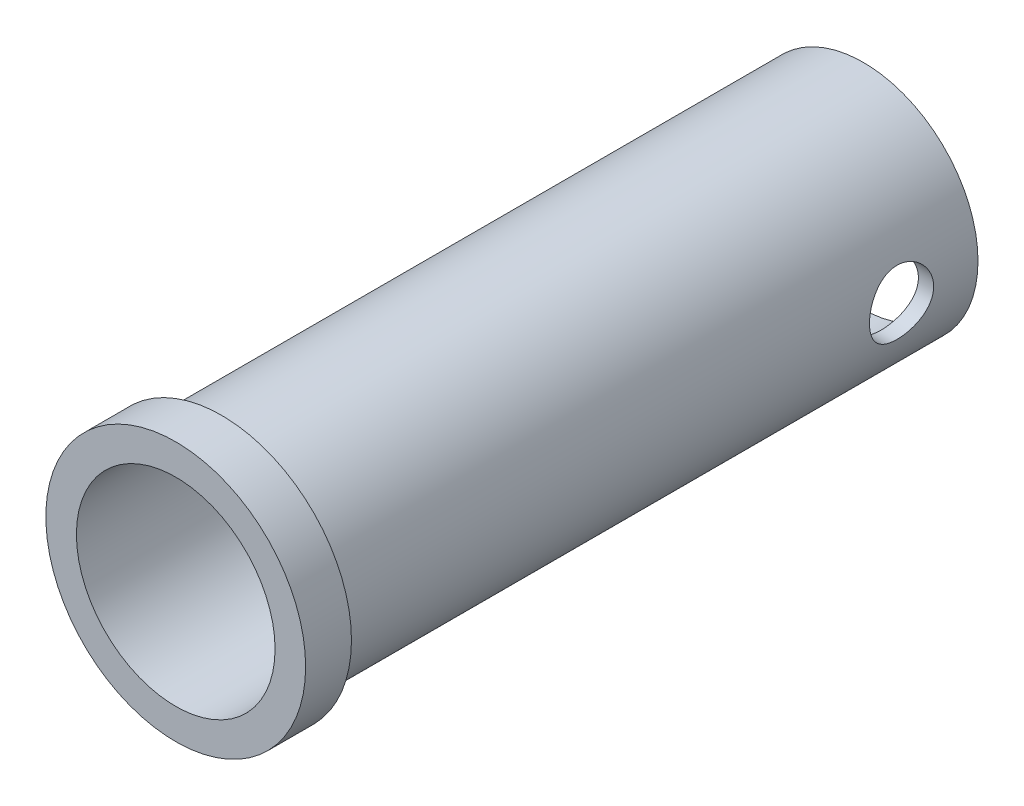
ISO-10303-21;
HEADER;
FILE_DESCRIPTION(('STEP AP214'),'2;1');
FILE_NAME('part.step','',(''),(''),'','','');
FILE_SCHEMA(('AUTOMOTIVE_DESIGN { 1 0 10303 214 1 1 1 1 }'));
ENDSEC;
DATA;
#1=APPLICATION_CONTEXT('core data for automotive mechanical design processes');
#2=APPLICATION_PROTOCOL_DEFINITION('international standard','automotive_design',2000,#1);
#3=PRODUCT_CONTEXT('',#1,'mechanical');
#4=PRODUCT('Part','Part','',(#3));
#5=PRODUCT_RELATED_PRODUCT_CATEGORY('part','',(#4));
#6=PRODUCT_DEFINITION_FORMATION('','',#4);
#7=PRODUCT_DEFINITION_CONTEXT('part definition',#1,'design');
#8=PRODUCT_DEFINITION('design','',#6,#7);
#9=PRODUCT_DEFINITION_SHAPE('','',#8);
#10=(LENGTH_UNIT() NAMED_UNIT(*) SI_UNIT(.MILLI.,.METRE.));
#11=(NAMED_UNIT(*) PLANE_ANGLE_UNIT() SI_UNIT($,.RADIAN.));
#12=(NAMED_UNIT(*) SI_UNIT($,.STERADIAN.) SOLID_ANGLE_UNIT());
#13=UNCERTAINTY_MEASURE_WITH_UNIT(LENGTH_MEASURE(1.E-05),#10,'distance_accuracy_value','');
#14=(GEOMETRIC_REPRESENTATION_CONTEXT(3) GLOBAL_UNCERTAINTY_ASSIGNED_CONTEXT((#13)) GLOBAL_UNIT_ASSIGNED_CONTEXT((#10,
#11,#12)) REPRESENTATION_CONTEXT('',''));
#15=CARTESIAN_POINT('',(0.,0.,0.));
#16=DIRECTION('',(0.,0.,1.));
#17=DIRECTION('',(1.,0.,0.));
#18=AXIS2_PLACEMENT_3D('',#15,#16,#17);
#19=CARTESIAN_POINT('',(0.,0.,0.));
#20=DIRECTION('',(0.,0.,1.));
#21=DIRECTION('',(1.,0.,0.));
#22=AXIS2_PLACEMENT_3D('',#19,#20,#21);
#23=PLANE('',#22);
#24=CARTESIAN_POINT('',(0.,0.,0.));
#25=DIRECTION('',(0.,0.,1.));
#26=DIRECTION('',(1.,0.,0.));
#27=AXIS2_PLACEMENT_3D('',#24,#25,#26);
#28=CIRCLE('',#27,8.5);
#29=CARTESIAN_POINT('',(8.5,0.,0.));
#30=VERTEX_POINT('',#29);
#31=EDGE_CURVE('E53',#30,#30,#28,.T.);
#32=ORIENTED_EDGE('',*,*,#31,.F.);
#33=EDGE_LOOP('',(#32));
#34=FACE_BOUND('',#33,.T.);
#35=CARTESIAN_POINT('',(0.,0.,0.));
#36=DIRECTION('',(0.,0.,1.));
#37=DIRECTION('',(1.,0.,0.));
#38=AXIS2_PLACEMENT_3D('',#35,#36,#37);
#39=CIRCLE('',#38,7.5);
#40=CARTESIAN_POINT('',(7.5,0.,0.));
#41=VERTEX_POINT('',#40);
#42=EDGE_CURVE('E10',#41,#41,#39,.F.);
#43=ORIENTED_EDGE('',*,*,#42,.F.);
#44=EDGE_LOOP('',(#43));
#45=FACE_BOUND('',#44,.T.);
#46=ADVANCED_FACE('F35',(#34,#45),#23,.F.);
#47=CARTESIAN_POINT('',(0.,0.,3.));
#48=DIRECTION('',(0.,0.,1.));
#49=DIRECTION('',(1.,0.,0.));
#50=AXIS2_PLACEMENT_3D('',#47,#48,#49);
#51=PLANE('',#50);
#52=CARTESIAN_POINT('',(0.,0.,3.));
#53=DIRECTION('',(0.,0.,1.));
#54=DIRECTION('',(1.,0.,0.));
#55=AXIS2_PLACEMENT_3D('',#52,#53,#54);
#56=CIRCLE('',#55,8.5);
#57=CARTESIAN_POINT('',(8.5,0.,3.));
#58=VERTEX_POINT('',#57);
#59=EDGE_CURVE('E48',#58,#58,#56,.T.);
#60=ORIENTED_EDGE('',*,*,#59,.T.);
#61=EDGE_LOOP('',(#60));
#62=FACE_BOUND('',#61,.T.);
#63=CARTESIAN_POINT('',(0.,0.,3.));
#64=DIRECTION('',(0.,0.,1.));
#65=DIRECTION('',(1.,0.,0.));
#66=AXIS2_PLACEMENT_3D('',#63,#64,#65);
#67=CIRCLE('',#66,6.5);
#68=CARTESIAN_POINT('',(6.5,0.,3.));
#69=VERTEX_POINT('',#68);
#70=EDGE_CURVE('E103',#69,#69,#67,.T.);
#71=ORIENTED_EDGE('',*,*,#70,.F.);
#72=EDGE_LOOP('',(#71));
#73=FACE_BOUND('',#72,.T.);
#74=ADVANCED_FACE('F91',(#62,#73),#51,.T.);
#75=CARTESIAN_POINT('',(0.,0.,3.));
#76=DIRECTION('',(0.,0.,-1.));
#77=DIRECTION('',(-1.,0.,0.));
#78=AXIS2_PLACEMENT_3D('',#75,#76,#77);
#79=CYLINDRICAL_SURFACE('',#78,8.5);
#80=ORIENTED_EDGE('',*,*,#59,.F.);
#81=EDGE_LOOP('',(#80));
#82=FACE_BOUND('',#81,.T.);
#83=ORIENTED_EDGE('',*,*,#31,.T.);
#84=EDGE_LOOP('',(#83));
#85=FACE_BOUND('',#84,.T.);
#86=ADVANCED_FACE('F37',(#82,#85),#79,.T.);
#87=CARTESIAN_POINT('',(0.,0.,3.));
#88=DIRECTION('',(0.,0.,-1.));
#89=DIRECTION('',(-1.,0.,0.));
#90=AXIS2_PLACEMENT_3D('',#87,#88,#89);
#91=CYLINDRICAL_SURFACE('',#90,6.5);
#92=CARTESIAN_POINT('',(-6.5,0.,-34.9));
#93=CARTESIAN_POINT('',(-6.49999984762594,-0.114780152678519,-34.900000133261));
#94=CARTESIAN_POINT('',(-6.49693136614676,-0.229562646212125,-34.909441164251));
#95=CARTESIAN_POINT('',(-6.48499201245018,-0.455758735968135,-34.9468485895127));
#96=CARTESIAN_POINT('',(-6.47612018587026,-0.567171774928907,-34.9748180307987));
#97=CARTESIAN_POINT('',(-6.45354073761235,-0.783334943692375,-35.0482319288698));
#98=CARTESIAN_POINT('',(-6.43984090576822,-0.888095487627851,-35.0936482462409));
#99=CARTESIAN_POINT('',(-6.40901183916854,-1.08851351392821,-35.2005432242407));
#100=CARTESIAN_POINT('',(-6.39188199424108,-1.18416937216912,-35.2620247433346));
#101=CARTESIAN_POINT('',(-6.35537555243329,-1.36679767568749,-35.4014233998814));
#102=CARTESIAN_POINT('',(-6.33594753880125,-1.45343019593023,-35.4797723483207));
#103=CARTESIAN_POINT('',(-6.29732467015338,-1.61258241008024,-35.6497631071621));
#104=CARTESIAN_POINT('',(-6.27812986315358,-1.68509924230959,-35.7414076064167));
#105=CARTESIAN_POINT('',(-6.24158803844324,-1.81585313888027,-35.9383894207329));
#106=CARTESIAN_POINT('',(-6.22430408492323,-1.87365695616512,-36.0440271375787));
#107=CARTESIAN_POINT('',(-6.19431848653863,-1.97053521369596,-36.2641730612946));
#108=CARTESIAN_POINT('',(-6.18161553983706,-2.00961497600927,-36.3786787368016));
#109=CARTESIAN_POINT('',(-6.16276983931889,-2.06667622660957,-36.6094591201013));
#110=CARTESIAN_POINT('',(-6.15643057256345,-2.08529153012779,-36.7255606061229));
#111=CARTESIAN_POINT('',(-6.15044761140109,-2.10287625070446,-36.9593986910689));
#112=CARTESIAN_POINT('',(-6.15080199454799,-2.101851308528,-37.0771348108124));
#113=CARTESIAN_POINT('',(-6.15799345504348,-2.08067854494973,-37.3055768377815));
#114=CARTESIAN_POINT('',(-6.16455379741828,-2.06134700904492,-37.4163686019231));
#115=CARTESIAN_POINT('',(-6.1829667959278,-2.00543737492301,-37.6330430309594));
#116=CARTESIAN_POINT('',(-6.1948200499337,-1.96885732834052,-37.7389251397825));
#117=CARTESIAN_POINT('',(-6.22268788340782,-1.87893383724713,-37.94467403774));
#118=CARTESIAN_POINT('',(-6.23876362994827,-1.82534134925148,-38.0444233394089));
#119=CARTESIAN_POINT('',(-6.2732382947439,-1.70308717246323,-38.2337759870639));
#120=CARTESIAN_POINT('',(-6.29163785022376,-1.63442134649959,-38.3233765372721));
#121=CARTESIAN_POINT('',(-6.32978643852367,-1.48000669369172,-38.4944892936782));
#122=CARTESIAN_POINT('',(-6.34955748594388,-1.39358721886844,-38.5753925649043));
#123=CARTESIAN_POINT('',(-6.38743186866717,-1.20816261133915,-38.7217118952384));
#124=CARTESIAN_POINT('',(-6.40553506275021,-1.10915641457954,-38.7871266436411));
#125=CARTESIAN_POINT('',(-6.43824721057395,-0.900136372310451,-38.9010630861593));
#126=CARTESIAN_POINT('',(-6.45282391669772,-0.790033092396685,-38.9494305995234));
#127=CARTESIAN_POINT('',(-6.47660732137455,-0.562670821437449,-39.0267726307963));
#128=CARTESIAN_POINT('',(-6.48581576747844,-0.4454141728024,-39.0557534601823));
#129=CARTESIAN_POINT('',(-6.49753974554395,-0.2122355686941,-39.0924414490988));
#130=CARTESIAN_POINT('',(-6.50031423039758,-0.0964560310383878,-39.1009721849127));
#131=CARTESIAN_POINT('',(-6.49962893282386,0.134897611158433,-39.0988518883504));
#132=CARTESIAN_POINT('',(-6.49617013124436,0.250471745156622,-39.0882038738745));
#133=CARTESIAN_POINT('',(-6.48357748396053,0.474897398486163,-39.0486849183147));
#134=CARTESIAN_POINT('',(-6.47459876244501,0.583846122334335,-39.0203117592815));
#135=CARTESIAN_POINT('',(-6.4520280403984,0.795399868811155,-38.9467627922165));
#136=CARTESIAN_POINT('',(-6.43843545964271,0.898004091655653,-38.9015848708016));
#137=CARTESIAN_POINT('',(-6.40759659592119,1.09685611026068,-38.7944320236055));
#138=CARTESIAN_POINT('',(-6.39026632979125,1.19287645758088,-38.7320598528518));
#139=CARTESIAN_POINT('',(-6.35392571159687,1.37335993471931,-38.5927605608013));
#140=CARTESIAN_POINT('',(-6.33491487544933,1.45781971658138,-38.5158292384573));
#141=CARTESIAN_POINT('',(-6.29633442103443,1.61651818338125,-38.3457209755327));
#142=CARTESIAN_POINT('',(-6.27677542522803,1.69016938349651,-38.2519922563222));
#143=CARTESIAN_POINT('',(-6.24014795835414,1.82076055180556,-38.053082794392));
#144=CARTESIAN_POINT('',(-6.22307947542276,1.87770059960644,-37.9479021062294));
#145=CARTESIAN_POINT('',(-6.19354517835395,1.97293988416011,-37.7291691602628));
#146=CARTESIAN_POINT('',(-6.18106547836716,2.0112954720899,-37.6156434271913));
#147=CARTESIAN_POINT('',(-6.16226449334382,2.06819042623143,-37.3832533722931));
#148=CARTESIAN_POINT('',(-6.15594065306915,2.08673801486373,-37.2643912869866));
#149=CARTESIAN_POINT('',(-6.15044597744329,2.10287398644436,-37.0308786474295));
#150=CARTESIAN_POINT('',(-6.1509443099754,2.1014317073017,-36.9163020737839));
#151=CARTESIAN_POINT('',(-6.15822697913326,2.07999175555092,-36.6891122898019));
#152=CARTESIAN_POINT('',(-6.1650109834417,2.05999506389632,-36.5764989759905));
#153=CARTESIAN_POINT('',(-6.18386170119516,2.0026819067383,-36.3582971845668));
#154=CARTESIAN_POINT('',(-6.19583805979404,1.96566104718839,-36.2526226560169));
#155=CARTESIAN_POINT('',(-6.22369569223963,1.87558632651301,-36.0489019638837));
#156=CARTESIAN_POINT('',(-6.23957779800492,1.82252904910129,-35.9508574313432));
#157=CARTESIAN_POINT('',(-6.27427773405697,1.69932067816034,-35.7607816701388));
#158=CARTESIAN_POINT('',(-6.29318990404038,1.62855266631232,-35.6691676284927));
#159=CARTESIAN_POINT('',(-6.33140503172638,1.47299576999185,-35.4988017748997));
#160=CARTESIAN_POINT('',(-6.35070809559453,1.38820303038323,-35.4200535113792));
#161=CARTESIAN_POINT('',(-6.38835851966061,1.20335860583316,-35.2748254649872));
#162=CARTESIAN_POINT('',(-6.40664701425018,1.10286967112843,-35.2088851452565));
#163=CARTESIAN_POINT('',(-6.43943829822981,0.89164585017348,-35.0949130417628));
#164=CARTESIAN_POINT('',(-6.45394231934155,0.780914313486268,-35.0468754290718));
#165=CARTESIAN_POINT('',(-6.4767469097158,0.559731443724436,-34.972831945927));
#166=CARTESIAN_POINT('',(-6.48538779223929,0.449724427071783,-34.9456029358238));
#167=CARTESIAN_POINT('',(-6.49701374152978,0.226478517537958,-34.9091890379217));
#168=CARTESIAN_POINT('',(-6.50000015032999,0.113240398005008,-34.8999998685267));
#169=CARTESIAN_POINT('',(-6.5,0.,-34.9));
#170=B_SPLINE_CURVE_WITH_KNOTS('',3,(#92,#93,#94,#95,#96,#97,#98,#99,#100,#101,#102,#103,#104,
#105,#106,#107,#108,#109,#110,#111,#112,#113,#114,#115,#116,#117,#118,#119,#120,#121,#122,#123,
#124,#125,#126,#127,#128,#129,#130,#131,#132,#133,#134,#135,#136,#137,#138,#139,#140,#141,#142,
#143,#144,#145,#146,#147,#148,#149,#150,#151,#152,#153,#154,#155,#156,#157,#158,#159,#160,#161,
#162,#163,#164,#165,#166,#167,#168,#169),.UNSPECIFIED.,.T.,.F.,(4,2,2,2,2,2,2,2,2,2,2,2,2,2,2,2,
2,2,2,2,2,2,2,2,2,2,2,2,2,2,2,2,2,2,2,2,2,2,4),(0.,0.343923981095443,0.687904534857072,
1.03133260886579,1.37482183034691,1.72845644393134,2.08216267547617,2.4453183332506,
2.80837070746088,3.15983101194151,3.51119037698753,3.84758565907628,4.18401894896813,
4.52562389865708,4.86732272596723,5.22571361317306,5.5841348181231,5.94571918962465,
6.30718578731835,6.6538308659277,7.00042140245965,7.33769086053153,7.67500274828452,
8.02087649799563,8.36685020225927,8.72753837967961,9.088224838858,9.44781068404832,
9.80724720488734,10.1493177330619,10.4913701773347,10.8276953457348,11.1640922130562,
11.5144204767654,11.8648451997129,12.2278019086183,12.5906403392817,12.9300312044731,
13.2693415085097),.UNSPECIFIED.);
#171=CARTESIAN_POINT('',(-6.5,0.,-34.9));
#172=VERTEX_POINT('',#171);
#173=EDGE_CURVE('E81',#172,#172,#170,.T.);
#174=ORIENTED_EDGE('',*,*,#173,.F.);
#175=EDGE_LOOP('',(#174));
#176=FACE_BOUND('',#175,.T.);
#177=CARTESIAN_POINT('',(6.5,0.,-39.1));
#178=CARTESIAN_POINT('',(6.49999984762594,-0.114780152678519,-39.099999866739));
#179=CARTESIAN_POINT('',(6.49693136614676,-0.229562646212125,-39.090558835749));
#180=CARTESIAN_POINT('',(6.48499201245018,-0.455758735968135,-39.0531514104873));
#181=CARTESIAN_POINT('',(6.47612018587026,-0.567171774928906,-39.0251819692013));
#182=CARTESIAN_POINT('',(6.45354073761235,-0.783334943692377,-38.9517680711302));
#183=CARTESIAN_POINT('',(6.43984090576822,-0.888095487627855,-38.9063517537591));
#184=CARTESIAN_POINT('',(6.40901183916854,-1.08851351392822,-38.7994567757593));
#185=CARTESIAN_POINT('',(6.39188199424108,-1.18416937216913,-38.7379752566654));
#186=CARTESIAN_POINT('',(6.35537555243329,-1.36679767568749,-38.5985766001186));
#187=CARTESIAN_POINT('',(6.33594753880125,-1.45343019593023,-38.5202276516793));
#188=CARTESIAN_POINT('',(6.29732467015338,-1.61258241008024,-38.3502368928379));
#189=CARTESIAN_POINT('',(6.27812986315358,-1.68509924230959,-38.2585923935833));
#190=CARTESIAN_POINT('',(6.24158803844324,-1.81585313888027,-38.0616105792671));
#191=CARTESIAN_POINT('',(6.22430408492323,-1.87365695616512,-37.9559728624214));
#192=CARTESIAN_POINT('',(6.19431848653863,-1.97053521369596,-37.7358269387054));
#193=CARTESIAN_POINT('',(6.18161553983706,-2.00961497600927,-37.6213212631984));
#194=CARTESIAN_POINT('',(6.16276983931889,-2.06667622660957,-37.3905408798987));
#195=CARTESIAN_POINT('',(6.15643057256345,-2.08529153012779,-37.2744393938772));
#196=CARTESIAN_POINT('',(6.15044761140109,-2.10287625070446,-37.0406013089311));
#197=CARTESIAN_POINT('',(6.15080199454799,-2.101851308528,-36.9228651891877));
#198=CARTESIAN_POINT('',(6.15799345504348,-2.08067854494973,-36.6944231622185));
#199=CARTESIAN_POINT('',(6.16455379741828,-2.06134700904492,-36.5836313980769));
#200=CARTESIAN_POINT('',(6.1829667959278,-2.00543737492301,-36.3669569690406));
#201=CARTESIAN_POINT('',(6.1948200499337,-1.96885732834052,-36.2610748602176));
#202=CARTESIAN_POINT('',(6.22268788340782,-1.87893383724713,-36.05532596226));
#203=CARTESIAN_POINT('',(6.23876362994827,-1.82534134925148,-35.9555766605911));
#204=CARTESIAN_POINT('',(6.2732382947439,-1.70308717246323,-35.7662240129361));
#205=CARTESIAN_POINT('',(6.29163785022376,-1.63442134649959,-35.6766234627279));
#206=CARTESIAN_POINT('',(6.32978643852367,-1.48000669369172,-35.5055107063218));
#207=CARTESIAN_POINT('',(6.34955748594388,-1.39358721886844,-35.4246074350957));
#208=CARTESIAN_POINT('',(6.38743186866717,-1.20816261133915,-35.2782881047616));
#209=CARTESIAN_POINT('',(6.40553506275021,-1.10915641457954,-35.2128733563589));
#210=CARTESIAN_POINT('',(6.43824721057395,-0.900136372310451,-35.0989369138407));
#211=CARTESIAN_POINT('',(6.45282391669772,-0.790033092396685,-35.0505694004766));
#212=CARTESIAN_POINT('',(6.47660732137455,-0.562670821437449,-34.9732273692037));
#213=CARTESIAN_POINT('',(6.48581576747844,-0.4454141728024,-34.9442465398177));
#214=CARTESIAN_POINT('',(6.49753974554395,-0.2122355686941,-34.9075585509012));
#215=CARTESIAN_POINT('',(6.50031423039758,-0.0964560310383878,-34.8990278150873));
#216=CARTESIAN_POINT('',(6.49962893282386,0.134897611158433,-34.9011481116496));
#217=CARTESIAN_POINT('',(6.49617013124436,0.250471745156622,-34.9117961261255));
#218=CARTESIAN_POINT('',(6.48357748396053,0.474897398486163,-34.9513150816853));
#219=CARTESIAN_POINT('',(6.47459876244501,0.583846122334335,-34.9796882407185));
#220=CARTESIAN_POINT('',(6.4520280403984,0.795399868811155,-35.0532372077835));
#221=CARTESIAN_POINT('',(6.43843545964271,0.898004091655653,-35.0984151291984));
#222=CARTESIAN_POINT('',(6.40759659592119,1.09685611026068,-35.2055679763945));
#223=CARTESIAN_POINT('',(6.39026632979125,1.19287645758088,-35.2679401471482));
#224=CARTESIAN_POINT('',(6.35392571159687,1.37335993471931,-35.4072394391987));
#225=CARTESIAN_POINT('',(6.33491487544933,1.45781971658138,-35.4841707615427));
#226=CARTESIAN_POINT('',(6.29633442103443,1.61651818338125,-35.6542790244674));
#227=CARTESIAN_POINT('',(6.27677542522803,1.69016938349651,-35.7480077436778));
#228=CARTESIAN_POINT('',(6.24014795835414,1.82076055180556,-35.946917205608));
#229=CARTESIAN_POINT('',(6.22307947542276,1.87770059960644,-36.0520978937707));
#230=CARTESIAN_POINT('',(6.19354517835395,1.97293988416011,-36.2708308397372));
#231=CARTESIAN_POINT('',(6.18106547836716,2.0112954720899,-36.3843565728088));
#232=CARTESIAN_POINT('',(6.16226449334382,2.06819042623143,-36.6167466277069));
#233=CARTESIAN_POINT('',(6.15594065306915,2.08673801486373,-36.7356087130134));
#234=CARTESIAN_POINT('',(6.15044597744329,2.10287398644436,-36.9691213525705));
#235=CARTESIAN_POINT('',(6.1509443099754,2.1014317073017,-37.0836979262161));
#236=CARTESIAN_POINT('',(6.15822697913326,2.07999175555092,-37.3108877101982));
#237=CARTESIAN_POINT('',(6.1650109834417,2.05999506389632,-37.4235010240095));
#238=CARTESIAN_POINT('',(6.18386170119516,2.0026819067383,-37.6417028154332));
#239=CARTESIAN_POINT('',(6.19583805979404,1.96566104718839,-37.7473773439831));
#240=CARTESIAN_POINT('',(6.22369569223963,1.87558632651301,-37.9510980361164));
#241=CARTESIAN_POINT('',(6.23957779800492,1.82252904910129,-38.0491425686568));
#242=CARTESIAN_POINT('',(6.27427773405697,1.69932067816034,-38.2392183298612));
#243=CARTESIAN_POINT('',(6.29318990404038,1.62855266631232,-38.3308323715073));
#244=CARTESIAN_POINT('',(6.33140503172638,1.47299576999185,-38.5011982251003));
#245=CARTESIAN_POINT('',(6.35070809559453,1.38820303038323,-38.5799464886208));
#246=CARTESIAN_POINT('',(6.38835851966061,1.20335860583316,-38.7251745350128));
#247=CARTESIAN_POINT('',(6.40664701425018,1.10286967112843,-38.7911148547435));
#248=CARTESIAN_POINT('',(6.43943829822981,0.89164585017348,-38.9050869582372));
#249=CARTESIAN_POINT('',(6.45394231934155,0.780914313486268,-38.9531245709282));
#250=CARTESIAN_POINT('',(6.4767469097158,0.559731443724436,-39.027168054073));
#251=CARTESIAN_POINT('',(6.48538779223929,0.449724427071783,-39.0543970641763));
#252=CARTESIAN_POINT('',(6.49701374152978,0.226478517537958,-39.0908109620783));
#253=CARTESIAN_POINT('',(6.50000015032999,0.113240398005008,-39.1000001314733));
#254=CARTESIAN_POINT('',(6.5,0.,-39.1));
#255=B_SPLINE_CURVE_WITH_KNOTS('',3,(#177,#178,#179,#180,#181,#182,#183,#184,#185,#186,#187,
#188,#189,#190,#191,#192,#193,#194,#195,#196,#197,#198,#199,#200,#201,#202,#203,#204,#205,#206,
#207,#208,#209,#210,#211,#212,#213,#214,#215,#216,#217,#218,#219,#220,#221,#222,#223,#224,#225,
#226,#227,#228,#229,#230,#231,#232,#233,#234,#235,#236,#237,#238,#239,#240,#241,#242,#243,#244,
#245,#246,#247,#248,#249,#250,#251,#252,#253,#254),.UNSPECIFIED.,.T.,.F.,(4,2,2,2,2,2,2,2,2,2,2,
2,2,2,2,2,2,2,2,2,2,2,2,2,2,2,2,2,2,2,2,2,2,2,2,2,2,2,4),(0.,0.343923981095443,
0.687904534857072,1.0313326088658,1.37482183034691,1.72845644393134,2.08216267547617,
2.4453183332506,2.80837070746088,3.15983101194151,3.51119037698753,3.84758565907628,
4.18401894896813,4.52562389865708,4.86732272596723,5.22571361317306,5.5841348181231,
5.94571918962465,6.30718578731835,6.6538308659277,7.00042140245965,7.33769086053153,
7.67500274828452,8.02087649799563,8.36685020225927,8.72753837967961,9.088224838858,
9.44781068404832,9.80724720488734,10.1493177330619,10.4913701773347,10.8276953457348,
11.1640922130562,11.5144204767654,11.8648451997129,12.2278019086183,12.5906403392817,
12.9300312044731,13.2693415085097),.UNSPECIFIED.);
#256=CARTESIAN_POINT('',(6.5,0.,-39.1));
#257=VERTEX_POINT('',#256);
#258=EDGE_CURVE('E76',#257,#257,#255,.T.);
#259=ORIENTED_EDGE('',*,*,#258,.F.);
#260=EDGE_LOOP('',(#259));
#261=FACE_BOUND('',#260,.T.);
#262=ORIENTED_EDGE('',*,*,#70,.T.);
#263=EDGE_LOOP('',(#262));
#264=FACE_BOUND('',#263,.T.);
#265=CARTESIAN_POINT('',(0.,0.,-42.));
#266=DIRECTION('',(0.,0.,-1.));
#267=DIRECTION('',(-1.,0.,0.));
#268=AXIS2_PLACEMENT_3D('',#265,#266,#267);
#269=CIRCLE('',#268,6.5);
#270=CARTESIAN_POINT('',(-6.5,0.,-42.));
#271=VERTEX_POINT('',#270);
#272=EDGE_CURVE('E110',#271,#271,#269,.T.);
#273=ORIENTED_EDGE('',*,*,#272,.T.);
#274=EDGE_LOOP('',(#273));
#275=FACE_BOUND('',#274,.T.);
#276=ADVANCED_FACE('F86',(#176,#261,#264,#275),#91,.F.);
#277=CARTESIAN_POINT('',(0.,0.,-42.));
#278=DIRECTION('',(0.,0.,-1.));
#279=DIRECTION('',(-1.,0.,0.));
#280=AXIS2_PLACEMENT_3D('',#277,#278,#279);
#281=PLANE('',#280);
#282=CARTESIAN_POINT('',(0.,0.,-42.));
#283=DIRECTION('',(0.,0.,-1.));
#284=DIRECTION('',(-1.,0.,0.));
#285=AXIS2_PLACEMENT_3D('',#282,#283,#284);
#286=CIRCLE('',#285,7.5);
#287=CARTESIAN_POINT('',(-7.5,0.,-42.));
#288=VERTEX_POINT('',#287);
#289=EDGE_CURVE('E105',#288,#288,#286,.T.);
#290=ORIENTED_EDGE('',*,*,#289,.T.);
#291=EDGE_LOOP('',(#290));
#292=FACE_BOUND('',#291,.T.);
#293=ORIENTED_EDGE('',*,*,#272,.F.);
#294=EDGE_LOOP('',(#293));
#295=FACE_BOUND('',#294,.T.);
#296=ADVANCED_FACE('F70',(#292,#295),#281,.T.);
#297=CARTESIAN_POINT('',(0.,0.,-42.));
#298=DIRECTION('',(0.,0.,1.));
#299=DIRECTION('',(1.,0.,0.));
#300=AXIS2_PLACEMENT_3D('',#297,#298,#299);
#301=CYLINDRICAL_SURFACE('',#300,7.5);
#302=CARTESIAN_POINT('',(7.5,0.,-39.1));
#303=CARTESIAN_POINT('',(7.49999850044544,-0.115549071859457,-39.0999977340684));
#304=CARTESIAN_POINT('',(7.4973036885812,-0.231121705110066,-39.0904312983852));
#305=CARTESIAN_POINT('',(7.48681582636739,-0.458923495634751,-39.0524949173941));
#306=CARTESIAN_POINT('',(7.47902068682222,-0.571151263080414,-39.0241172665758));
#307=CARTESIAN_POINT('',(7.45919014801396,-0.788943238195506,-38.9495640201166));
#308=CARTESIAN_POINT('',(7.4471605273756,-0.894516296930382,-38.9034126714867));
#309=CARTESIAN_POINT('',(7.420124150391,-1.09642476541401,-38.7947157318247));
#310=CARTESIAN_POINT('',(7.40511711654645,-1.19275931288065,-38.7321686125134));
#311=CARTESIAN_POINT('',(7.37331332850794,-1.37589761639296,-38.5907831413099));
#312=CARTESIAN_POINT('',(7.35648356700851,-1.46243395483419,-38.5116058280896));
#313=CARTESIAN_POINT('',(7.32313712362264,-1.6211899497533,-38.3399312338879));
#314=CARTESIAN_POINT('',(7.30662048687786,-1.69340755595236,-38.2474320486357));
#315=CARTESIAN_POINT('',(7.27542837897222,-1.82281954418509,-38.0495555118287));
#316=CARTESIAN_POINT('',(7.26079431852521,-1.87969906189858,-37.9439651052421));
#317=CARTESIAN_POINT('',(7.23551274440862,-1.97478943248913,-37.7242430501572));
#318=CARTESIAN_POINT('',(7.22486441122792,-2.01300412356119,-37.6101131632707));
#319=CARTESIAN_POINT('',(7.20910195955085,-2.06873752873865,-37.3795301714627));
#320=CARTESIAN_POINT('',(7.20385758469793,-2.08674433574883,-37.2632041712619));
#321=CARTESIAN_POINT('',(7.19910829329382,-2.1030735498869,-37.0290732443517));
#322=CARTESIAN_POINT('',(7.1996021839581,-2.10140004786119,-36.9112686300798));
#323=CARTESIAN_POINT('',(7.20615747477844,-2.07880203719545,-36.6813944387992));
#324=CARTESIAN_POINT('',(7.21204577982249,-2.05847601372622,-36.5692602936321));
#325=CARTESIAN_POINT('',(7.22844816907821,-2.00011173806163,-36.3500614648778));
#326=CARTESIAN_POINT('',(7.23896265662278,-1.96207194147723,-36.2429972242109));
#327=CARTESIAN_POINT('',(7.2635793822286,-1.86889065894204,-36.0354547701562));
#328=CARTESIAN_POINT('',(7.27772396889439,-1.81354549979216,-35.9350732369257));
#329=CARTESIAN_POINT('',(7.30798533076003,-1.68746638599936,-35.7448156066742));
#330=CARTESIAN_POINT('',(7.32410252929097,-1.61672912560209,-35.654941772771));
#331=CARTESIAN_POINT('',(7.35720651544555,-1.4588475528645,-35.4848406076291));
#332=CARTESIAN_POINT('',(7.37420368441479,-1.37120287335207,-35.4050790082679));
#333=CARTESIAN_POINT('',(7.40663279030198,-1.18357169751817,-35.2612853049702));
#334=CARTESIAN_POINT('',(7.42206465234252,-1.08358461129692,-35.1972539532914));
#335=CARTESIAN_POINT('',(7.44973605200326,-0.873337450332607,-35.0865038081177));
#336=CARTESIAN_POINT('',(7.46195859911618,-0.763026733669785,-35.0398766273177));
#337=CARTESIAN_POINT('',(7.48171171416257,-0.535710183719855,-34.9659673387535));
#338=CARTESIAN_POINT('',(7.48924341618883,-0.418705976174606,-34.938680554894));
#339=CARTESIAN_POINT('',(7.498591647067,-0.185292401498557,-34.9049748769127));
#340=CARTESIAN_POINT('',(7.50058131296794,-0.0689811489871978,-34.8979235914578));
#341=CARTESIAN_POINT('',(7.49912299982235,0.16316463931841,-34.9031325567059));
#342=CARTESIAN_POINT('',(7.49567564523712,0.278999228327219,-34.9153905896642));
#343=CARTESIAN_POINT('',(7.48384311833654,0.504596268732405,-34.9583541024876));
#344=CARTESIAN_POINT('',(7.47555416236048,0.614432648474317,-34.9887003524127));
#345=CARTESIAN_POINT('',(7.4549851125704,0.827440079594194,-35.0665559249828));
#346=CARTESIAN_POINT('',(7.44270456537565,0.930610372215036,-35.1140671973673));
#347=CARTESIAN_POINT('',(7.41511700690706,1.12976408663136,-35.2260335149731));
#348=CARTESIAN_POINT('',(7.39975176074413,1.22555065053477,-35.2908239918027));
#349=CARTESIAN_POINT('',(7.36776719837964,1.40511158541057,-35.4350935103366));
#350=CARTESIAN_POINT('',(7.35114760881206,1.48888332632155,-35.5145757594014));
#351=CARTESIAN_POINT('',(7.31787944351906,1.64474908309542,-35.6889334558994));
#352=CARTESIAN_POINT('',(7.30124626249003,1.71639518266251,-35.7842130475328));
#353=CARTESIAN_POINT('',(7.27039890541724,1.84269980125677,-35.9857997561693));
#354=CARTESIAN_POINT('',(7.25618463899512,1.89735895503359,-36.0921064609252));
#355=CARTESIAN_POINT('',(7.23195038062151,1.98773352270873,-36.3122566986658));
#356=CARTESIAN_POINT('',(7.221907440962,2.02355287826429,-36.4260548958874));
#357=CARTESIAN_POINT('',(7.20716859474244,2.07544269963814,-36.6583932173263));
#358=CARTESIAN_POINT('',(7.20247114750862,2.0915188559322,-36.7769319650244));
#359=CARTESIAN_POINT('',(7.19909300510936,2.10311465515799,-37.0107756368505));
#360=CARTESIAN_POINT('',(7.20020048759655,2.09935796340976,-37.1260421256435));
#361=CARTESIAN_POINT('',(7.20780629176382,2.07309224060162,-37.3542278974938));
#362=CARTESIAN_POINT('',(7.21430444668272,2.05058378962983,-37.4671472530492));
#363=CARTESIAN_POINT('',(7.23182691657987,1.98789228158042,-37.6864176936546));
#364=CARTESIAN_POINT('',(7.24280810607179,1.94787737568998,-37.7928205480618));
#365=CARTESIAN_POINT('',(7.26805665519029,1.85143886377055,-37.9974856029703));
#366=CARTESIAN_POINT('',(7.28232457679045,1.79501245122782,-38.0957464074128));
#367=CARTESIAN_POINT('',(7.31311239075332,1.66522213518896,-38.2847555918117));
#368=CARTESIAN_POINT('',(7.32968998213804,1.59137155804019,-38.3751604077316));
#369=CARTESIAN_POINT('',(7.36292421204913,1.42973554613914,-38.542529066278));
#370=CARTESIAN_POINT('',(7.37958086922697,1.3419466468612,-38.6194895571519));
#371=CARTESIAN_POINT('',(7.41158138369391,1.15235163570581,-38.759635179466));
#372=CARTESIAN_POINT('',(7.42688347042849,1.05025658819515,-38.8224398452787));
#373=CARTESIAN_POINT('',(7.453978020383,0.836529392791802,-38.929897916664));
#374=CARTESIAN_POINT('',(7.46577250453007,0.72490278447528,-38.9745617796204));
#375=CARTESIAN_POINT('',(7.48318647397412,0.511578272572151,-39.0393389906795));
#376=CARTESIAN_POINT('',(7.48944328125704,0.410708274492529,-39.0620307555928));
#377=CARTESIAN_POINT('',(7.49785046352107,0.206564929983065,-39.0923613529761));
#378=CARTESIAN_POINT('',(7.50000134048509,0.103291878908548,-39.1000020255666));
#379=CARTESIAN_POINT('',(7.5,0.,-39.1));
#380=B_SPLINE_CURVE_WITH_KNOTS('',3,(#302,#303,#304,#305,#306,#307,#308,#309,#310,#311,#312,
#313,#314,#315,#316,#317,#318,#319,#320,#321,#322,#323,#324,#325,#326,#327,#328,#329,#330,#331,
#332,#333,#334,#335,#336,#337,#338,#339,#340,#341,#342,#343,#344,#345,#346,#347,#348,#349,#350,
#351,#352,#353,#354,#355,#356,#357,#358,#359,#360,#361,#362,#363,#364,#365,#366,#367,#368,#369,
#370,#371,#372,#373,#374,#375,#376,#377,#378,#379),.UNSPECIFIED.,.T.,.F.,(4,2,2,2,2,2,2,2,2,2,2,
2,2,2,2,2,2,2,2,2,2,2,2,2,2,2,2,2,2,2,2,2,2,2,2,2,2,2,4),(0.,0.346268182086731,
0.692678291376705,1.03861748991141,1.38458894553262,1.73844946991323,2.09236062654245,
2.45306282264886,2.8136908134657,3.16540713829203,3.51705035491518,3.85779089256617,
4.19856114350904,4.54350342442871,4.88851986168954,5.24599927407037,5.60349577863915,
5.96284840125164,6.32211411040287,6.6700230161466,7.01789196621454,7.35907226789236,
7.70029133572955,8.04868889915357,8.39716261126662,8.75655041081179,9.11592477953095,
9.47329506480395,9.83056232297605,10.1748857034315,10.5191984325936,10.8602742217547,
11.2014083722409,11.5535216990377,11.9057226849497,12.2664877844676,12.6270446224261,
12.936619283113,13.2461560933912),.UNSPECIFIED.);
#381=CARTESIAN_POINT('',(7.5,0.,-39.1));
#382=VERTEX_POINT('',#381);
#383=EDGE_CURVE('E39',#382,#382,#380,.T.);
#384=ORIENTED_EDGE('',*,*,#383,.T.);
#385=EDGE_LOOP('',(#384));
#386=FACE_BOUND('',#385,.T.);
#387=CARTESIAN_POINT('',(-7.5,0.,-39.1));
#388=CARTESIAN_POINT('',(-7.49999850044544,0.115549071859457,-39.0999977340684));
#389=CARTESIAN_POINT('',(-7.4973036885812,0.231121705110066,-39.0904312983852));
#390=CARTESIAN_POINT('',(-7.48681582636739,0.458923495634751,-39.0524949173941));
#391=CARTESIAN_POINT('',(-7.47902068682222,0.571151263080414,-39.0241172665758));
#392=CARTESIAN_POINT('',(-7.45919014801396,0.788943238195506,-38.9495640201166));
#393=CARTESIAN_POINT('',(-7.4471605273756,0.894516296930382,-38.9034126714867));
#394=CARTESIAN_POINT('',(-7.420124150391,1.09642476541401,-38.7947157318247));
#395=CARTESIAN_POINT('',(-7.40511711654645,1.19275931288065,-38.7321686125134));
#396=CARTESIAN_POINT('',(-7.37331332850794,1.37589761639296,-38.5907831413099));
#397=CARTESIAN_POINT('',(-7.35648356700851,1.46243395483419,-38.5116058280896));
#398=CARTESIAN_POINT('',(-7.32313712362264,1.6211899497533,-38.3399312338879));
#399=CARTESIAN_POINT('',(-7.30662048687786,1.69340755595236,-38.2474320486357));
#400=CARTESIAN_POINT('',(-7.27542837897222,1.82281954418509,-38.0495555118287));
#401=CARTESIAN_POINT('',(-7.26079431852521,1.87969906189858,-37.9439651052421));
#402=CARTESIAN_POINT('',(-7.23551274440862,1.97478943248913,-37.7242430501572));
#403=CARTESIAN_POINT('',(-7.22486441122792,2.01300412356119,-37.6101131632707));
#404=CARTESIAN_POINT('',(-7.20910195955085,2.06873752873865,-37.3795301714627));
#405=CARTESIAN_POINT('',(-7.20385758469793,2.08674433574883,-37.2632041712619));
#406=CARTESIAN_POINT('',(-7.19910829329382,2.1030735498869,-37.0290732443517));
#407=CARTESIAN_POINT('',(-7.1996021839581,2.10140004786119,-36.9112686300798));
#408=CARTESIAN_POINT('',(-7.20615747477844,2.07880203719545,-36.6813944387992));
#409=CARTESIAN_POINT('',(-7.21204577982249,2.05847601372622,-36.5692602936321));
#410=CARTESIAN_POINT('',(-7.22844816907821,2.00011173806163,-36.3500614648778));
#411=CARTESIAN_POINT('',(-7.23896265662278,1.96207194147723,-36.2429972242109));
#412=CARTESIAN_POINT('',(-7.2635793822286,1.86889065894204,-36.0354547701562));
#413=CARTESIAN_POINT('',(-7.27772396889439,1.81354549979216,-35.9350732369257));
#414=CARTESIAN_POINT('',(-7.30798533076003,1.68746638599936,-35.7448156066742));
#415=CARTESIAN_POINT('',(-7.32410252929097,1.61672912560209,-35.654941772771));
#416=CARTESIAN_POINT('',(-7.35720651544555,1.4588475528645,-35.4848406076291));
#417=CARTESIAN_POINT('',(-7.37420368441479,1.37120287335207,-35.4050790082679));
#418=CARTESIAN_POINT('',(-7.40663279030198,1.18357169751817,-35.2612853049702));
#419=CARTESIAN_POINT('',(-7.42206465234252,1.08358461129692,-35.1972539532914));
#420=CARTESIAN_POINT('',(-7.44973605200326,0.873337450332607,-35.0865038081177));
#421=CARTESIAN_POINT('',(-7.46195859911618,0.763026733669785,-35.0398766273177));
#422=CARTESIAN_POINT('',(-7.48171171416257,0.535710183719855,-34.9659673387535));
#423=CARTESIAN_POINT('',(-7.48924341618883,0.418705976174606,-34.938680554894));
#424=CARTESIAN_POINT('',(-7.498591647067,0.185292401498557,-34.9049748769127));
#425=CARTESIAN_POINT('',(-7.50058131296794,0.0689811489871978,-34.8979235914578));
#426=CARTESIAN_POINT('',(-7.49912299982235,-0.16316463931841,-34.9031325567059));
#427=CARTESIAN_POINT('',(-7.49567564523712,-0.278999228327219,-34.9153905896642));
#428=CARTESIAN_POINT('',(-7.48384311833654,-0.504596268732405,-34.9583541024876));
#429=CARTESIAN_POINT('',(-7.47555416236048,-0.614432648474317,-34.9887003524127));
#430=CARTESIAN_POINT('',(-7.4549851125704,-0.827440079594194,-35.0665559249828));
#431=CARTESIAN_POINT('',(-7.44270456537565,-0.930610372215036,-35.1140671973673));
#432=CARTESIAN_POINT('',(-7.41511700690706,-1.12976408663136,-35.2260335149731));
#433=CARTESIAN_POINT('',(-7.39975176074413,-1.22555065053477,-35.2908239918027));
#434=CARTESIAN_POINT('',(-7.36776719837964,-1.40511158541057,-35.4350935103366));
#435=CARTESIAN_POINT('',(-7.35114760881206,-1.48888332632155,-35.5145757594014));
#436=CARTESIAN_POINT('',(-7.31787944351906,-1.64474908309542,-35.6889334558994));
#437=CARTESIAN_POINT('',(-7.30124626249003,-1.71639518266251,-35.7842130475328));
#438=CARTESIAN_POINT('',(-7.27039890541724,-1.84269980125677,-35.9857997561693));
#439=CARTESIAN_POINT('',(-7.25618463899512,-1.89735895503359,-36.0921064609252));
#440=CARTESIAN_POINT('',(-7.23195038062151,-1.98773352270873,-36.3122566986658));
#441=CARTESIAN_POINT('',(-7.221907440962,-2.02355287826429,-36.4260548958874));
#442=CARTESIAN_POINT('',(-7.20716859474244,-2.07544269963814,-36.6583932173263));
#443=CARTESIAN_POINT('',(-7.20247114750862,-2.0915188559322,-36.7769319650244));
#444=CARTESIAN_POINT('',(-7.19909300510936,-2.10311465515799,-37.0107756368505));
#445=CARTESIAN_POINT('',(-7.20020048759655,-2.09935796340976,-37.1260421256435));
#446=CARTESIAN_POINT('',(-7.20780629176382,-2.07309224060162,-37.3542278974938));
#447=CARTESIAN_POINT('',(-7.21430444668272,-2.05058378962983,-37.4671472530492));
#448=CARTESIAN_POINT('',(-7.23182691657987,-1.98789228158042,-37.6864176936546));
#449=CARTESIAN_POINT('',(-7.24280810607179,-1.94787737568998,-37.7928205480618));
#450=CARTESIAN_POINT('',(-7.26805665519029,-1.85143886377055,-37.9974856029703));
#451=CARTESIAN_POINT('',(-7.28232457679045,-1.79501245122782,-38.0957464074128));
#452=CARTESIAN_POINT('',(-7.31311239075332,-1.66522213518896,-38.2847555918117));
#453=CARTESIAN_POINT('',(-7.32968998213804,-1.59137155804019,-38.3751604077316));
#454=CARTESIAN_POINT('',(-7.36292421204913,-1.42973554613914,-38.542529066278));
#455=CARTESIAN_POINT('',(-7.37958086922697,-1.3419466468612,-38.6194895571519));
#456=CARTESIAN_POINT('',(-7.41158138369391,-1.15235163570581,-38.759635179466));
#457=CARTESIAN_POINT('',(-7.42688347042849,-1.05025658819515,-38.8224398452787));
#458=CARTESIAN_POINT('',(-7.453978020383,-0.836529392791802,-38.929897916664));
#459=CARTESIAN_POINT('',(-7.46577250453007,-0.72490278447528,-38.9745617796204));
#460=CARTESIAN_POINT('',(-7.48318647397412,-0.511578272572151,-39.0393389906795));
#461=CARTESIAN_POINT('',(-7.48944328125704,-0.410708274492529,-39.0620307555928));
#462=CARTESIAN_POINT('',(-7.49785046352107,-0.206564929983065,-39.0923613529761));
#463=CARTESIAN_POINT('',(-7.50000134048509,-0.103291878908548,-39.1000020255666));
#464=CARTESIAN_POINT('',(-7.5,0.,-39.1));
#465=B_SPLINE_CURVE_WITH_KNOTS('',3,(#387,#388,#389,#390,#391,#392,#393,#394,#395,#396,#397,
#398,#399,#400,#401,#402,#403,#404,#405,#406,#407,#408,#409,#410,#411,#412,#413,#414,#415,#416,
#417,#418,#419,#420,#421,#422,#423,#424,#425,#426,#427,#428,#429,#430,#431,#432,#433,#434,#435,
#436,#437,#438,#439,#440,#441,#442,#443,#444,#445,#446,#447,#448,#449,#450,#451,#452,#453,#454,
#455,#456,#457,#458,#459,#460,#461,#462,#463,#464),.UNSPECIFIED.,.T.,.F.,(4,2,2,2,2,2,2,2,2,2,2,
2,2,2,2,2,2,2,2,2,2,2,2,2,2,2,2,2,2,2,2,2,2,2,2,2,2,2,4),(0.,0.346268182086731,
0.692678291376706,1.03861748991141,1.38458894553262,1.73844946991323,2.09236062654245,
2.45306282264886,2.81369081346569,3.16540713829203,3.51705035491518,3.85779089256617,
4.19856114350904,4.54350342442871,4.88851986168954,5.24599927407037,5.60349577863915,
5.96284840125164,6.32211411040287,6.6700230161466,7.01789196621454,7.35907226789236,
7.70029133572955,8.04868889915357,8.39716261126662,8.75655041081179,9.11592477953095,
9.47329506480395,9.83056232297605,10.1748857034315,10.5191984325936,10.8602742217547,
11.2014083722409,11.5535216990377,11.9057226849497,12.2664877844676,12.6270446224261,
12.936619283113,13.2461560933912),.UNSPECIFIED.);
#466=CARTESIAN_POINT('',(-7.5,0.,-39.1));
#467=VERTEX_POINT('',#466);
#468=EDGE_CURVE('E56',#467,#467,#465,.T.);
#469=ORIENTED_EDGE('',*,*,#468,.T.);
#470=EDGE_LOOP('',(#469));
#471=FACE_BOUND('',#470,.T.);
#472=ORIENTED_EDGE('',*,*,#289,.F.);
#473=EDGE_LOOP('',(#472));
#474=FACE_BOUND('',#473,.T.);
#475=ORIENTED_EDGE('',*,*,#42,.T.);
#476=EDGE_LOOP('',(#475));
#477=FACE_BOUND('',#476,.T.);
#478=ADVANCED_FACE('F61',(#386,#471,#474,#477),#301,.T.);
#479=CARTESIAN_POINT('',(-8.5,0.,-37.));
#480=DIRECTION('',(1.,0.,0.));
#481=DIRECTION('',(0.,0.,-1.));
#482=AXIS2_PLACEMENT_3D('',#479,#480,#481);
#483=CYLINDRICAL_SURFACE('',#482,2.1);
#484=ORIENTED_EDGE('',*,*,#173,.T.);
#485=EDGE_LOOP('',(#484));
#486=FACE_BOUND('',#485,.T.);
#487=ORIENTED_EDGE('',*,*,#468,.F.);
#488=EDGE_LOOP('',(#487));
#489=FACE_BOUND('',#488,.T.);
#490=ADVANCED_FACE('F65',(#486,#489),#483,.F.);
#491=ORIENTED_EDGE('',*,*,#258,.T.);
#492=EDGE_LOOP('',(#491));
#493=FACE_BOUND('',#492,.T.);
#494=ORIENTED_EDGE('',*,*,#383,.F.);
#495=EDGE_LOOP('',(#494));
#496=FACE_BOUND('',#495,.T.);
#497=ADVANCED_FACE('F68',(#493,#496),#483,.F.);
#498=CLOSED_SHELL('',(#46,#74,#86,#276,#296,#478,#490,#497));
#499=MANIFOLD_SOLID_BREP('B2',#498);
#500=ADVANCED_BREP_SHAPE_REPRESENTATION('',(#18,#499),#14);
#501=SHAPE_DEFINITION_REPRESENTATION(#9,#500);
ENDSEC;
END-ISO-10303-21;
